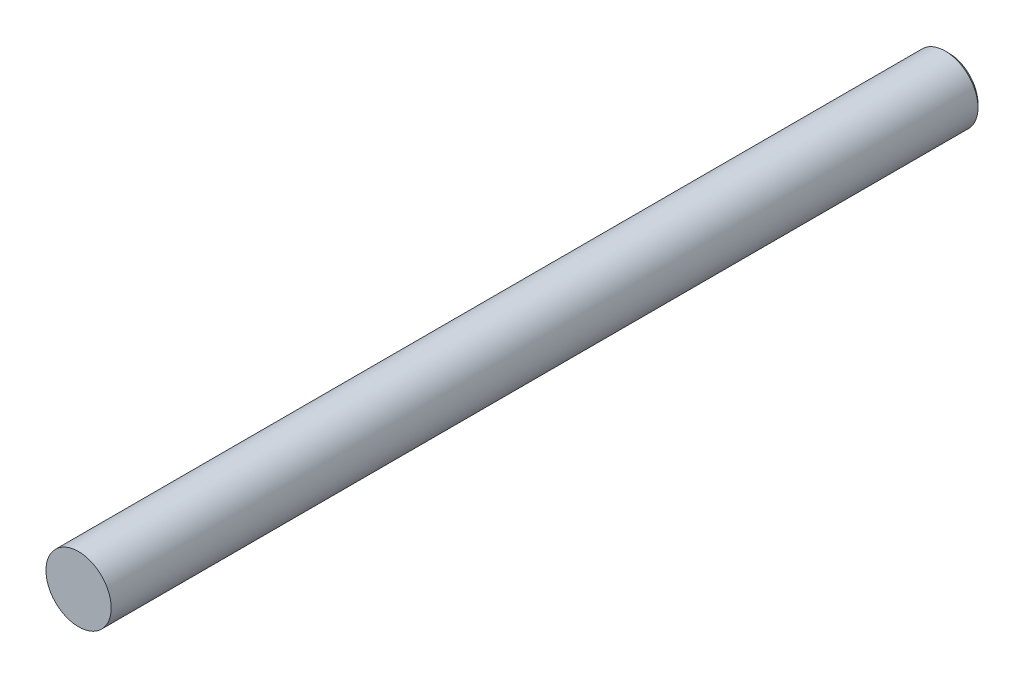
ISO-10303-21;
HEADER;
FILE_DESCRIPTION(('STEP AP214'),'2;1');
FILE_NAME('part.step','',(''),(''),'','','');
FILE_SCHEMA(('AUTOMOTIVE_DESIGN { 1 0 10303 214 1 1 1 1 }'));
ENDSEC;
DATA;
#1=APPLICATION_CONTEXT('core data for automotive mechanical design processes');
#2=APPLICATION_PROTOCOL_DEFINITION('international standard','automotive_design',2000,#1);
#3=PRODUCT_CONTEXT('',#1,'mechanical');
#4=PRODUCT('Part','Part','',(#3));
#5=PRODUCT_RELATED_PRODUCT_CATEGORY('part','',(#4));
#6=PRODUCT_DEFINITION_FORMATION('','',#4);
#7=PRODUCT_DEFINITION_CONTEXT('part definition',#1,'design');
#8=PRODUCT_DEFINITION('design','',#6,#7);
#9=PRODUCT_DEFINITION_SHAPE('','',#8);
#10=(LENGTH_UNIT() NAMED_UNIT(*) SI_UNIT(.MILLI.,.METRE.));
#11=(NAMED_UNIT(*) PLANE_ANGLE_UNIT() SI_UNIT($,.RADIAN.));
#12=(NAMED_UNIT(*) SI_UNIT($,.STERADIAN.) SOLID_ANGLE_UNIT());
#13=UNCERTAINTY_MEASURE_WITH_UNIT(LENGTH_MEASURE(1.E-05),#10,'distance_accuracy_value','');
#14=(GEOMETRIC_REPRESENTATION_CONTEXT(3) GLOBAL_UNCERTAINTY_ASSIGNED_CONTEXT((#13)) GLOBAL_UNIT_ASSIGNED_CONTEXT((#10,
#11,#12)) REPRESENTATION_CONTEXT('',''));
#15=CARTESIAN_POINT('',(0.,0.,0.));
#16=DIRECTION('',(0.,0.,1.));
#17=DIRECTION('',(1.,0.,0.));
#18=AXIS2_PLACEMENT_3D('',#15,#16,#17);
#19=CARTESIAN_POINT('',(0.,0.,40.));
#20=DIRECTION('',(0.,0.,-1.));
#21=DIRECTION('',(-1.,0.,0.));
#22=AXIS2_PLACEMENT_3D('',#19,#20,#21);
#23=CYLINDRICAL_SURFACE('',#22,3.);
#24=CARTESIAN_POINT('',(0.,0.,-39.7));
#25=DIRECTION('',(0.,0.,1.));
#26=DIRECTION('',(1.,0.,0.));
#27=AXIS2_PLACEMENT_3D('',#24,#25,#26);
#28=CIRCLE('',#27,3.);
#29=CARTESIAN_POINT('',(3.,0.,-39.7));
#30=VERTEX_POINT('',#29);
#31=EDGE_CURVE('E43',#30,#30,#28,.T.);
#32=ORIENTED_EDGE('',*,*,#31,.T.);
#33=EDGE_LOOP('',(#32));
#34=FACE_BOUND('',#33,.T.);
#35=CARTESIAN_POINT('',(0.,0.,40.));
#36=DIRECTION('',(0.,0.,1.));
#37=DIRECTION('',(1.,0.,0.));
#38=AXIS2_PLACEMENT_3D('',#35,#36,#37);
#39=CIRCLE('',#38,3.);
#40=CARTESIAN_POINT('',(3.,0.,40.));
#41=VERTEX_POINT('',#40);
#42=EDGE_CURVE('E47',#41,#41,#39,.T.);
#43=ORIENTED_EDGE('',*,*,#42,.F.);
#44=EDGE_LOOP('',(#43));
#45=FACE_BOUND('',#44,.T.);
#46=ADVANCED_FACE('F36',(#34,#45),#23,.T.);
#47=CARTESIAN_POINT('',(0.,0.,40.));
#48=DIRECTION('',(0.,0.,1.));
#49=DIRECTION('',(1.,0.,0.));
#50=AXIS2_PLACEMENT_3D('',#47,#48,#49);
#51=PLANE('',#50);
#52=ORIENTED_EDGE('',*,*,#42,.T.);
#53=EDGE_LOOP('',(#52));
#54=FACE_BOUND('',#53,.T.);
#55=ADVANCED_FACE('F54',(#54),#51,.T.);
#56=CARTESIAN_POINT('',(0.,0.,-40.));
#57=DIRECTION('',(0.,0.,1.));
#58=DIRECTION('',(1.,0.,0.));
#59=AXIS2_PLACEMENT_3D('',#56,#57,#58);
#60=PLANE('',#59);
#61=CARTESIAN_POINT('',(0.,0.,-40.));
#62=DIRECTION('',(0.,0.,1.));
#63=DIRECTION('',(1.,0.,0.));
#64=AXIS2_PLACEMENT_3D('',#61,#62,#63);
#65=CIRCLE('',#64,2.70000000000002);
#66=CARTESIAN_POINT('',(2.70000000000002,0.,-40.));
#67=VERTEX_POINT('',#66);
#68=EDGE_CURVE('E10',#67,#67,#65,.F.);
#69=ORIENTED_EDGE('',*,*,#68,.T.);
#70=EDGE_LOOP('',(#69));
#71=FACE_BOUND('',#70,.T.);
#72=ADVANCED_FACE('F60',(#71),#60,.F.);
#73=CARTESIAN_POINT('',(0.,0.,-39.7));
#74=DIRECTION('',(0.,0.,1.));
#75=DIRECTION('',(1.,0.,0.));
#76=AXIS2_PLACEMENT_3D('',#73,#74,#75);
#77=CONICAL_SURFACE('',#76,3.,0.785398163397445);
#78=ORIENTED_EDGE('',*,*,#68,.F.);
#79=EDGE_LOOP('',(#78));
#80=FACE_BOUND('',#79,.T.);
#81=ORIENTED_EDGE('',*,*,#31,.F.);
#82=EDGE_LOOP('',(#81));
#83=FACE_BOUND('',#82,.T.);
#84=ADVANCED_FACE('F38',(#80,#83),#77,.T.);
#85=CLOSED_SHELL('',(#46,#55,#72,#84));
#86=MANIFOLD_SOLID_BREP('B2',#85);
#87=ADVANCED_BREP_SHAPE_REPRESENTATION('',(#18,#86),#14);
#88=SHAPE_DEFINITION_REPRESENTATION(#9,#87);
ENDSEC;
END-ISO-10303-21;
